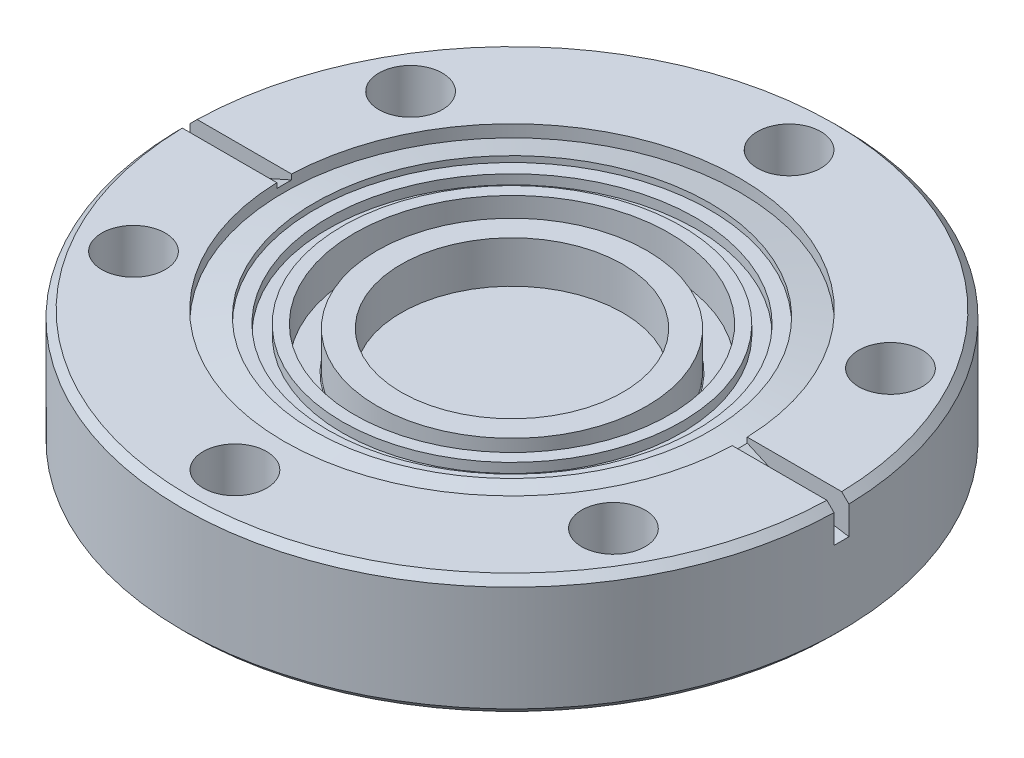
ISO-10303-21;
HEADER;
FILE_DESCRIPTION(('STEP AP214'),'2;1');
FILE_NAME('part.step','',(''),(''),'','','');
FILE_SCHEMA(('AUTOMOTIVE_DESIGN { 1 0 10303 214 1 1 1 1 }'));
ENDSEC;
DATA;
#1=APPLICATION_CONTEXT('core data for automotive mechanical design processes');
#2=APPLICATION_PROTOCOL_DEFINITION('international standard','automotive_design',2000,#1);
#3=PRODUCT_CONTEXT('',#1,'mechanical');
#4=PRODUCT('Part','Part','',(#3));
#5=PRODUCT_RELATED_PRODUCT_CATEGORY('part','',(#4));
#6=PRODUCT_DEFINITION_FORMATION('','',#4);
#7=PRODUCT_DEFINITION_CONTEXT('part definition',#1,'design');
#8=PRODUCT_DEFINITION('design','',#6,#7);
#9=PRODUCT_DEFINITION_SHAPE('','',#8);
#10=(LENGTH_UNIT() NAMED_UNIT(*) SI_UNIT(.MILLI.,.METRE.));
#11=(NAMED_UNIT(*) PLANE_ANGLE_UNIT() SI_UNIT($,.RADIAN.));
#12=(NAMED_UNIT(*) SI_UNIT($,.STERADIAN.) SOLID_ANGLE_UNIT());
#13=UNCERTAINTY_MEASURE_WITH_UNIT(LENGTH_MEASURE(1.E-05),#10,'distance_accuracy_value','');
#14=(GEOMETRIC_REPRESENTATION_CONTEXT(3) GLOBAL_UNCERTAINTY_ASSIGNED_CONTEXT((#13)) GLOBAL_UNIT_ASSIGNED_CONTEXT((#10,
#11,#12)) REPRESENTATION_CONTEXT('',''));
#15=CARTESIAN_POINT('',(0.,0.,0.));
#16=DIRECTION('',(0.,0.,1.));
#17=DIRECTION('',(1.,0.,0.));
#18=AXIS2_PLACEMENT_3D('',#15,#16,#17);
#19=CARTESIAN_POINT('',(0.,6.56400008,0.));
#20=DIRECTION('',(0.,1.,0.));
#21=DIRECTION('',(0.,0.,-1.));
#22=AXIS2_PLACEMENT_3D('',#19,#20,#21);
#23=PLANE('',#22);
#24=CARTESIAN_POINT('',(0.,6.56400008,0.));
#25=DIRECTION('',(0.,1.,0.));
#26=DIRECTION('',(0.,0.,-1.));
#27=AXIS2_PLACEMENT_3D('',#24,#25,#26);
#28=CIRCLE('',#27,11.7475);
#29=CARTESIAN_POINT('',(0.,6.56400008,-11.7475));
#30=VERTEX_POINT('',#29);
#31=EDGE_CURVE('E11',#30,#30,#28,.T.);
#32=ORIENTED_EDGE('',*,*,#31,.T.);
#33=EDGE_LOOP('',(#32));
#34=FACE_BOUND('',#33,.T.);
#35=ADVANCED_FACE('F16',(#34),#23,.T.);
#36=CARTESIAN_POINT('',(14.2820349882239,11.00900008,-0.395136489265077));
#37=DIRECTION('',(0.,1.,0.));
#38=DIRECTION('',(0.,0.,-1.));
#39=AXIS2_PLACEMENT_3D('',#36,#37,#38);
#40=PLANE('',#39);
#41=CARTESIAN_POINT('',(0.,11.00900008,0.));
#42=DIRECTION('',(0.,-1.,0.));
#43=DIRECTION('',(0.,0.,-1.));
#44=AXIS2_PLACEMENT_3D('',#41,#42,#43);
#45=CIRCLE('',#44,11.7475);
#46=CARTESIAN_POINT('',(0.,11.00900008,-11.7475));
#47=VERTEX_POINT('',#46);
#48=EDGE_CURVE('E27',#47,#47,#45,.T.);
#49=ORIENTED_EDGE('',*,*,#48,.T.);
#50=EDGE_LOOP('',(#49));
#51=FACE_BOUND('',#50,.T.);
#52=CARTESIAN_POINT('',(0.,11.00900008,0.));
#53=DIRECTION('',(0.,-1.,0.));
#54=DIRECTION('',(0.,0.,-1.));
#55=AXIS2_PLACEMENT_3D('',#52,#53,#54);
#56=CIRCLE('',#55,14.2875);
#57=CARTESIAN_POINT('',(0.,11.00900008,-14.2875));
#58=VERTEX_POINT('',#57);
#59=EDGE_CURVE('E331',#58,#58,#56,.T.);
#60=ORIENTED_EDGE('',*,*,#59,.F.);
#61=EDGE_LOOP('',(#60));
#62=FACE_BOUND('',#61,.T.);
#63=ADVANCED_FACE('F447',(#51,#62),#40,.T.);
#64=CARTESIAN_POINT('',(19.0427133176319,6.94500008,-0.526848652353438));
#65=DIRECTION('',(0.,1.,0.));
#66=DIRECTION('',(0.,0.,-1.));
#67=AXIS2_PLACEMENT_3D('',#64,#65,#66);
#68=PLANE('',#67);
#69=CARTESIAN_POINT('',(1.24288562814053E-05,6.94500008,-3.4386519109572E-07));
#70=DIRECTION('',(0.,-1.,0.));
#71=DIRECTION('',(-0.027656961005235,0.,-0.999617473090559));
#72=AXIS2_PLACEMENT_3D('',#69,#70,#71);
#73=CIRCLE('',#72,14.3891000000054);
#74=CARTESIAN_POINT('',(-0.397946348744294,6.94500008,-14.3835961259179));
#75=VERTEX_POINT('',#74);
#76=CARTESIAN_POINT('',(0.397946348744296,6.94500008,14.3835961259179));
#77=VERTEX_POINT('',#76);
#78=EDGE_CURVE('E354',#75,#77,#73,.T.);
#79=ORIENTED_EDGE('',*,*,#78,.T.);
#80=CARTESIAN_POINT('',(-1.2428855969155E-05,6.94500008,3.43865174182167E-07));
#81=DIRECTION('',(0.,-1.,0.));
#82=DIRECTION('',(0.0276569610052135,0.,0.99961747309056));
#83=AXIS2_PLACEMENT_3D('',#80,#81,#82);
#84=CIRCLE('',#83,14.3891000000054);
#85=EDGE_CURVE('E292',#77,#75,#84,.T.);
#86=ORIENTED_EDGE('',*,*,#85,.T.);
#87=EDGE_LOOP('',(#79,#86));
#88=FACE_BOUND('',#87,.T.);
#89=CARTESIAN_POINT('',(0.,6.94500008,0.));
#90=DIRECTION('',(0.,-1.,0.));
#91=DIRECTION('',(0.,0.,-1.));
#92=AXIS2_PLACEMENT_3D('',#89,#90,#91);
#93=CIRCLE('',#92,19.05);
#94=CARTESIAN_POINT('',(0.,6.94500008,-19.05));
#95=VERTEX_POINT('',#94);
#96=EDGE_CURVE('E280',#95,#95,#93,.T.);
#97=ORIENTED_EDGE('',*,*,#96,.F.);
#98=EDGE_LOOP('',(#97));
#99=FACE_BOUND('',#98,.T.);
#100=ADVANCED_FACE('F445',(#88,#99),#68,.T.);
#101=CARTESIAN_POINT('',(19.05,0.614634301939151,0.));
#102=DIRECTION('',(0.,1.,0.));
#103=DIRECTION('',(1.,0.,0.));
#104=AXIS2_PLACEMENT_3D('',#101,#102,#103);
#105=PLANE('',#104);
#106=CARTESIAN_POINT('',(0.,0.614634301939151,0.));
#107=DIRECTION('',(0.,1.,0.));
#108=DIRECTION('',(-1.,0.,0.));
#109=AXIS2_PLACEMENT_3D('',#106,#107,#108);
#110=CIRCLE('',#109,19.1135);
#111=CARTESIAN_POINT('',(-19.1135,0.614634301939151,0.));
#112=VERTEX_POINT('',#111);
#113=EDGE_CURVE('E288',#112,#112,#110,.T.);
#114=ORIENTED_EDGE('',*,*,#113,.T.);
#115=EDGE_LOOP('',(#114));
#116=FACE_BOUND('',#115,.T.);
#117=CARTESIAN_POINT('',(0.,0.614634301939151,0.));
#118=DIRECTION('',(0.,-1.,0.));
#119=DIRECTION('',(0.,0.,-1.));
#120=AXIS2_PLACEMENT_3D('',#117,#118,#119);
#121=CIRCLE('',#120,19.05);
#122=CARTESIAN_POINT('',(0.,0.614634301939151,-19.05));
#123=VERTEX_POINT('',#122);
#124=EDGE_CURVE('E293',#123,#123,#121,.T.);
#125=ORIENTED_EDGE('',*,*,#124,.T.);
#126=EDGE_LOOP('',(#125));
#127=FACE_BOUND('',#126,.T.);
#128=ADVANCED_FACE('F434',(#116,#127),#105,.T.);
#129=CARTESIAN_POINT('',(7.23381749884376,7.5184,-15.0384358639262));
#130=DIRECTION('',(0.,-1.,0.));
#131=DIRECTION('',(0.,0.,-1.));
#132=AXIS2_PLACEMENT_3D('',#129,#130,#131);
#133=PLANE('',#132);
#134=CARTESIAN_POINT('',(0.,7.5184,0.));
#135=DIRECTION('',(0.,1.,0.));
#136=DIRECTION('',(-1.,0.,0.));
#137=AXIS2_PLACEMENT_3D('',#134,#135,#136);
#138=CIRCLE('',#137,16.6878);
#139=CARTESIAN_POINT('',(-16.6878,7.5184,0.));
#140=VERTEX_POINT('',#139);
#141=EDGE_CURVE('E309',#140,#140,#138,.T.);
#142=ORIENTED_EDGE('',*,*,#141,.T.);
#143=EDGE_LOOP('',(#142));
#144=FACE_BOUND('',#143,.T.);
#145=CARTESIAN_POINT('',(0.,7.5184,0.));
#146=DIRECTION('',(0.,-1.,0.));
#147=DIRECTION('',(-1.,0.,0.));
#148=AXIS2_PLACEMENT_3D('',#145,#146,#147);
#149=CIRCLE('',#148,19.1135);
#150=CARTESIAN_POINT('',(-19.1135,7.5184,0.));
#151=VERTEX_POINT('',#150);
#152=EDGE_CURVE('E305',#151,#151,#149,.T.);
#153=ORIENTED_EDGE('',*,*,#152,.T.);
#154=EDGE_LOOP('',(#153));
#155=FACE_BOUND('',#154,.T.);
#156=ADVANCED_FACE('F455',(#144,#155),#133,.T.);
#157=CARTESIAN_POINT('',(7.23381749884379,11.4046,-15.0384358639262));
#158=DIRECTION('',(0.,1.,0.));
#159=DIRECTION('',(1.,0.,0.));
#160=AXIS2_PLACEMENT_3D('',#157,#158,#159);
#161=PLANE('',#160);
#162=CARTESIAN_POINT('',(0.,11.4046,0.));
#163=DIRECTION('',(0.,-1.,0.));
#164=DIRECTION('',(-1.,0.,0.));
#165=AXIS2_PLACEMENT_3D('',#162,#163,#164);
#166=CIRCLE('',#165,16.6878);
#167=CARTESIAN_POINT('',(-16.6878,11.4046,0.));
#168=VERTEX_POINT('',#167);
#169=EDGE_CURVE('E310',#168,#168,#166,.T.);
#170=ORIENTED_EDGE('',*,*,#169,.T.);
#171=EDGE_LOOP('',(#170));
#172=FACE_BOUND('',#171,.T.);
#173=CARTESIAN_POINT('',(0.,11.4046,0.));
#174=DIRECTION('',(0.,-1.,0.));
#175=DIRECTION('',(0.,0.,1.));
#176=AXIS2_PLACEMENT_3D('',#173,#174,#175);
#177=CIRCLE('',#176,17.9705);
#178=CARTESIAN_POINT('',(0.,11.4046,17.9705));
#179=VERTEX_POINT('',#178);
#180=EDGE_CURVE('E276',#179,#179,#177,.T.);
#181=ORIENTED_EDGE('',*,*,#180,.F.);
#182=EDGE_LOOP('',(#181));
#183=FACE_BOUND('',#182,.T.);
#184=ADVANCED_FACE('F474',(#172,#183),#161,.T.);
#185=CARTESIAN_POINT('',(-17.9705,10.3886,0.));
#186=DIRECTION('',(0.,1.,0.));
#187=DIRECTION('',(1.,0.,0.));
#188=AXIS2_PLACEMENT_3D('',#185,#186,#187);
#189=PLANE('',#188);
#190=CARTESIAN_POINT('',(0.,10.3886,0.));
#191=DIRECTION('',(0.,1.,0.));
#192=DIRECTION('',(0.,0.,1.));
#193=AXIS2_PLACEMENT_3D('',#190,#191,#192);
#194=CIRCLE('',#193,19.4945);
#195=CARTESIAN_POINT('',(0.,10.3886,19.4945));
#196=VERTEX_POINT('',#195);
#197=EDGE_CURVE('E360',#196,#196,#194,.T.);
#198=ORIENTED_EDGE('',*,*,#197,.T.);
#199=EDGE_LOOP('',(#198));
#200=FACE_BOUND('',#199,.T.);
#201=CARTESIAN_POINT('',(0.,10.3886,0.));
#202=DIRECTION('',(0.,-1.,0.));
#203=DIRECTION('',(0.,0.,1.));
#204=AXIS2_PLACEMENT_3D('',#201,#202,#203);
#205=CIRCLE('',#204,17.9705);
#206=CARTESIAN_POINT('',(0.,10.3886,17.9705));
#207=VERTEX_POINT('',#206);
#208=EDGE_CURVE('E407',#207,#207,#205,.T.);
#209=ORIENTED_EDGE('',*,*,#208,.T.);
#210=EDGE_LOOP('',(#209));
#211=FACE_BOUND('',#210,.T.);
#212=ADVANCED_FACE('F470',(#200,#211),#189,.T.);
#213=CARTESIAN_POINT('',(0.,4.064,0.));
#214=DIRECTION('',(0.,-1.,0.));
#215=DIRECTION('',(-1.,0.,0.));
#216=AXIS2_PLACEMENT_3D('',#213,#214,#215);
#217=PLANE('',#216);
#218=CARTESIAN_POINT('',(0.,4.064,0.));
#219=DIRECTION('',(0.,-1.,0.));
#220=DIRECTION('',(0.,0.,-1.));
#221=AXIS2_PLACEMENT_3D('',#218,#219,#220);
#222=CIRCLE('',#221,11.7475);
#223=CARTESIAN_POINT('',(0.,4.064,-11.7475));
#224=VERTEX_POINT('',#223);
#225=EDGE_CURVE('E395',#224,#224,#222,.T.);
#226=ORIENTED_EDGE('',*,*,#225,.T.);
#227=EDGE_LOOP('',(#226));
#228=FACE_BOUND('',#227,.T.);
#229=ADVANCED_FACE('F473',(#228),#217,.T.);
#230=CARTESIAN_POINT('',(-20.955,11.4046,0.));
#231=DIRECTION('',(0.,1.,0.));
#232=DIRECTION('',(1.,0.,0.));
#233=AXIS2_PLACEMENT_3D('',#230,#231,#232);
#234=PLANE('',#233);
#235=CARTESIAN_POINT('',(0.,11.4046,0.));
#236=DIRECTION('',(0.,1.,0.));
#237=DIRECTION('',(0.,0.,1.));
#238=AXIS2_PLACEMENT_3D('',#235,#236,#237);
#239=CIRCLE('',#238,20.955);
#240=CARTESIAN_POINT('',(0.,11.4046,20.955));
#241=VERTEX_POINT('',#240);
#242=EDGE_CURVE('E391',#241,#241,#239,.T.);
#243=ORIENTED_EDGE('',*,*,#242,.T.);
#244=EDGE_LOOP('',(#243));
#245=FACE_BOUND('',#244,.T.);
#246=CARTESIAN_POINT('',(0.,11.4046,0.));
#247=DIRECTION('',(0.,-1.,0.));
#248=DIRECTION('',(0.,0.,1.));
#249=AXIS2_PLACEMENT_3D('',#246,#247,#248);
#250=CIRCLE('',#249,19.4945);
#251=CARTESIAN_POINT('',(0.,11.4046,19.4945));
#252=VERTEX_POINT('',#251);
#253=EDGE_CURVE('E396',#252,#252,#250,.T.);
#254=ORIENTED_EDGE('',*,*,#253,.T.);
#255=EDGE_LOOP('',(#254));
#256=FACE_BOUND('',#255,.T.);
#257=ADVANCED_FACE('F613',(#245,#256),#234,.T.);
#258=CARTESIAN_POINT('',(11.7475,0.0254000000000026,0.));
#259=DIRECTION('',(0.,-1.,0.));
#260=DIRECTION('',(0.,0.,-1.));
#261=AXIS2_PLACEMENT_3D('',#258,#259,#260);
#262=PLANE('',#261);
#263=CARTESIAN_POINT('',(0.,0.0254000000000018,0.));
#264=DIRECTION('',(0.,1.,0.));
#265=DIRECTION('',(0.,0.,-1.));
#266=AXIS2_PLACEMENT_3D('',#263,#264,#265);
#267=CIRCLE('',#266,11.7475);
#268=CARTESIAN_POINT('',(0.,0.0254000000000018,-11.7475));
#269=VERTEX_POINT('',#268);
#270=EDGE_CURVE('E558',#269,#269,#267,.T.);
#271=ORIENTED_EDGE('',*,*,#270,.T.);
#272=EDGE_LOOP('',(#271));
#273=FACE_BOUND('',#272,.T.);
#274=CARTESIAN_POINT('',(0.,0.0254000000000018,0.));
#275=DIRECTION('',(0.,1.,0.));
#276=DIRECTION('',(-1.,0.,0.));
#277=AXIS2_PLACEMENT_3D('',#274,#275,#276);
#278=CIRCLE('',#277,19.6215);
#279=CARTESIAN_POINT('',(-19.6215,0.025400000000001,0.));
#280=VERTEX_POINT('',#279);
#281=EDGE_CURVE('E281',#280,#280,#278,.T.);
#282=ORIENTED_EDGE('',*,*,#281,.F.);
#283=EDGE_LOOP('',(#282));
#284=FACE_BOUND('',#283,.T.);
#285=ADVANCED_FACE('F616',(#273,#284),#262,.T.);
#286=CARTESIAN_POINT('',(7.54210804673972,8.2296,-15.6793433284467));
#287=DIRECTION('',(0.,1.,0.));
#288=DIRECTION('',(1.,0.,0.));
#289=AXIS2_PLACEMENT_3D('',#286,#287,#288);
#290=PLANE('',#289);
#291=CARTESIAN_POINT('',(0.,8.2296,0.));
#292=DIRECTION('',(0.,1.,0.));
#293=DIRECTION('',(-1.,0.,0.));
#294=AXIS2_PLACEMENT_3D('',#291,#292,#293);
#295=CIRCLE('',#294,19.6215);
#296=CARTESIAN_POINT('',(-19.6215,8.2296,0.));
#297=VERTEX_POINT('',#296);
#298=EDGE_CURVE('E401',#297,#297,#295,.T.);
#299=ORIENTED_EDGE('',*,*,#298,.T.);
#300=EDGE_LOOP('',(#299));
#301=FACE_BOUND('',#300,.T.);
#302=CARTESIAN_POINT('',(0.,8.2296,0.));
#303=DIRECTION('',(0.,1.,0.));
#304=DIRECTION('',(-1.,0.,0.));
#305=AXIS2_PLACEMENT_3D('',#302,#303,#304);
#306=CIRCLE('',#305,17.399);
#307=CARTESIAN_POINT('',(-17.399,8.2296,0.));
#308=VERTEX_POINT('',#307);
#309=EDGE_CURVE('E20',#308,#308,#306,.T.);
#310=ORIENTED_EDGE('',*,*,#309,.F.);
#311=EDGE_LOOP('',(#310));
#312=FACE_BOUND('',#311,.T.);
#313=ADVANCED_FACE('F722',(#301,#312),#290,.T.);
#314=CARTESIAN_POINT('',(39.3735976154095,43.5831901653029,-0.7874));
#315=DIRECTION('',(0.,0.,1.));
#316=DIRECTION('',(1.,0.,0.));
#317=AXIS2_PLACEMENT_3D('',#314,#315,#316);
#318=CYLINDRICAL_SURFACE('',#317,34.925);
#319=CARTESIAN_POINT('',(39.3735976154095,43.5831901653029,0.7874));
#320=DIRECTION('',(0.,0.,1.));
#321=DIRECTION('',(1.,0.,0.));
#322=AXIS2_PLACEMENT_3D('',#319,#320,#321);
#323=CIRCLE('',#322,34.925);
#324=CARTESIAN_POINT('',(24.1425630453769,12.15436246005,0.7874));
#325=VERTEX_POINT('',#324);
#326=CARTESIAN_POINT('',(34.9161227263281,8.94381166895559,0.7874));
#327=VERTEX_POINT('',#326);
#328=EDGE_CURVE('E397',#325,#327,#323,.T.);
#329=ORIENTED_EDGE('',*,*,#328,.T.);
#330=CARTESIAN_POINT('',(0.573146945675652,13.363144774907,0.));
#331=DIRECTION('',(-0.127629918083853,-0.991821861026419,0.));
#332=DIRECTION('',(0.991565520297985,-0.127596931569382,-0.022734159546025));
#333=AXIS2_PLACEMENT_3D('',#330,#331,#332);
#334=CIRCLE('',#333,34.6351048696525);
#335=CARTESIAN_POINT('',(34.9161227263281,8.94381166895559,-0.7874));
#336=VERTEX_POINT('',#335);
#337=EDGE_CURVE('E314',#336,#327,#334,.T.);
#338=ORIENTED_EDGE('',*,*,#337,.F.);
#339=CARTESIAN_POINT('',(39.3735976154095,43.5831901653029,-0.7874));
#340=DIRECTION('',(0.,0.,1.));
#341=DIRECTION('',(1.,0.,0.));
#342=AXIS2_PLACEMENT_3D('',#339,#340,#341);
#343=CIRCLE('',#342,34.925);
#344=CARTESIAN_POINT('',(24.1425630453769,12.15436246005,-0.7874));
#345=VERTEX_POINT('',#344);
#346=EDGE_CURVE('E287',#345,#336,#343,.T.);
#347=ORIENTED_EDGE('',*,*,#346,.F.);
#348=CARTESIAN_POINT('',(4.59799701094588,21.6260476186121,2.09738910267321E-13));
#349=DIRECTION('',(-0.436106931139257,-0.899894851975662,0.));
#350=DIRECTION('',(0.899304030600688,-0.435820607358067,-0.0362306327215305));
#351=AXIS2_PLACEMENT_3D('',#348,#349,#350);
#352=CIRCLE('',#351,21.732990589819);
#353=EDGE_CURVE('E353',#345,#325,#352,.T.);
#354=ORIENTED_EDGE('',*,*,#353,.T.);
#355=EDGE_LOOP('',(#329,#338,#347,#354));
#356=FACE_BOUND('',#355,.T.);
#357=ADVANCED_FACE('F719',(#356),#318,.F.);
#358=CARTESIAN_POINT('',(-39.3735976154095,43.5831901653029,-0.7874));
#359=DIRECTION('',(0.,0.,1.));
#360=DIRECTION('',(1.,0.,0.));
#361=AXIS2_PLACEMENT_3D('',#358,#359,#360);
#362=CYLINDRICAL_SURFACE('',#361,34.925);
#363=CARTESIAN_POINT('',(-39.3735976154095,43.5831901653029,-0.7874));
#364=DIRECTION('',(0.,0.,-1.));
#365=DIRECTION('',(1.,0.,0.));
#366=AXIS2_PLACEMENT_3D('',#363,#364,#365);
#367=CIRCLE('',#366,34.925);
#368=CARTESIAN_POINT('',(-24.1425630453769,12.15436246005,-0.7874));
#369=VERTEX_POINT('',#368);
#370=CARTESIAN_POINT('',(-34.9161227263281,8.94381166895559,-0.7874));
#371=VERTEX_POINT('',#370);
#372=EDGE_CURVE('E349',#369,#371,#367,.T.);
#373=ORIENTED_EDGE('',*,*,#372,.T.);
#374=CARTESIAN_POINT('',(-0.573146945692759,13.3631447748945,0.));
#375=DIRECTION('',(0.127629918083561,-0.991821861026456,0.));
#376=DIRECTION('',(-0.991565520298023,-0.12759693156909,0.0227341595460376));
#377=AXIS2_PLACEMENT_3D('',#374,#375,#376);
#378=CIRCLE('',#377,34.6351048696339);
#379=CARTESIAN_POINT('',(-34.9161227263281,8.94381166895559,0.7874));
#380=VERTEX_POINT('',#379);
#381=EDGE_CURVE('E324',#380,#371,#378,.T.);
#382=ORIENTED_EDGE('',*,*,#381,.F.);
#383=CARTESIAN_POINT('',(-39.3735976154095,43.5831901653029,0.7874));
#384=DIRECTION('',(0.,0.,-1.));
#385=DIRECTION('',(1.,0.,0.));
#386=AXIS2_PLACEMENT_3D('',#383,#384,#385);
#387=CIRCLE('',#386,34.925);
#388=CARTESIAN_POINT('',(-24.1425630453769,12.15436246005,0.7874));
#389=VERTEX_POINT('',#388);
#390=EDGE_CURVE('E386',#389,#380,#387,.T.);
#391=ORIENTED_EDGE('',*,*,#390,.F.);
#392=CARTESIAN_POINT('',(-4.59799701093826,21.6260476186169,0.));
#393=DIRECTION('',(0.436106931139297,-0.899894851975643,0.));
#394=DIRECTION('',(-0.89930403060067,-0.435820607358107,0.0362306327215076));
#395=AXIS2_PLACEMENT_3D('',#392,#393,#394);
#396=CIRCLE('',#395,21.7329905898279);
#397=EDGE_CURVE('E286',#389,#369,#396,.T.);
#398=ORIENTED_EDGE('',*,*,#397,.T.);
#399=EDGE_LOOP('',(#373,#382,#391,#398));
#400=FACE_BOUND('',#399,.T.);
#401=ADVANCED_FACE('F721',(#400),#362,.F.);
#402=CARTESIAN_POINT('',(39.3735976154095,43.5831901653029,-0.7874));
#403=DIRECTION('',(0.,0.,1.));
#404=DIRECTION('',(1.,0.,0.));
#405=AXIS2_PLACEMENT_3D('',#402,#403,#404);
#406=PLANE('',#405);
#407=DIRECTION('',(1.,0.,0.));
#408=VECTOR('',#407,1.);
#409=CARTESIAN_POINT('',(-34.163,12.7,-0.7874));
#410=LINE('',#409,#408);
#411=CARTESIAN_POINT('',(24.1425630453769,12.7,-0.7874));
#412=VERTEX_POINT('',#411);
#413=CARTESIAN_POINT('',(34.1539246681843,12.7,-0.7874));
#414=VERTEX_POINT('',#413);
#415=EDGE_CURVE('E275',#412,#414,#410,.T.);
#416=ORIENTED_EDGE('',*,*,#415,.F.);
#417=DIRECTION('',(0.,-1.,0.));
#418=VECTOR('',#417,1.);
#419=CARTESIAN_POINT('',(24.1425630453769,43.5831901653029,-0.7874));
#420=LINE('',#419,#418);
#421=EDGE_CURVE('E282',#412,#345,#420,.T.);
#422=ORIENTED_EDGE('',*,*,#421,.T.);
#423=ORIENTED_EDGE('',*,*,#346,.T.);
#424=DIRECTION('',(0.,-1.,0.));
#425=VECTOR('',#424,1.);
#426=CARTESIAN_POINT('',(34.9161227263281,0.,-0.7874));
#427=LINE('',#426,#425);
#428=CARTESIAN_POINT('',(34.9161227263281,11.938,-0.7874));
#429=VERTEX_POINT('',#428);
#430=EDGE_CURVE('E327',#429,#336,#427,.T.);
#431=ORIENTED_EDGE('',*,*,#430,.F.);
#432=DIRECTION('',(-0.707198658456387,0.707014891977168,0.));
#433=VECTOR('',#432,1.);
#434=CARTESIAN_POINT('',(34.9161227263281,11.938,-0.7874));
#435=LINE('',#434,#433);
#436=EDGE_CURVE('E381',#429,#414,#435,.T.);
#437=ORIENTED_EDGE('',*,*,#436,.T.);
#438=EDGE_LOOP('',(#416,#422,#423,#431,#437));
#439=FACE_BOUND('',#438,.T.);
#440=ADVANCED_FACE('F468',(#439),#406,.T.);
#441=CARTESIAN_POINT('',(39.3735976154095,43.5831901653029,0.7874));
#442=DIRECTION('',(0.,0.,1.));
#443=DIRECTION('',(1.,0.,0.));
#444=AXIS2_PLACEMENT_3D('',#441,#442,#443);
#445=PLANE('',#444);
#446=DIRECTION('',(-1.,0.,0.));
#447=VECTOR('',#446,1.);
#448=CARTESIAN_POINT('',(-34.163,12.7,0.7874));
#449=LINE('',#448,#447);
#450=CARTESIAN_POINT('',(34.1539246681843,12.7,0.7874));
#451=VERTEX_POINT('',#450);
#452=CARTESIAN_POINT('',(24.1425630453769,12.7,0.7874));
#453=VERTEX_POINT('',#452);
#454=EDGE_CURVE('E337',#451,#453,#449,.T.);
#455=ORIENTED_EDGE('',*,*,#454,.F.);
#456=DIRECTION('',(-0.70719865845639,0.707014891977165,0.));
#457=VECTOR('',#456,1.);
#458=CARTESIAN_POINT('',(34.5350236972561,12.319,0.7874));
#459=LINE('',#458,#457);
#460=CARTESIAN_POINT('',(34.9161227263281,11.938,0.7874));
#461=VERTEX_POINT('',#460);
#462=EDGE_CURVE('E415',#461,#451,#459,.T.);
#463=ORIENTED_EDGE('',*,*,#462,.F.);
#464=DIRECTION('',(0.,1.,0.));
#465=VECTOR('',#464,1.);
#466=CARTESIAN_POINT('',(34.9161227263281,0.,0.7874));
#467=LINE('',#466,#465);
#468=EDGE_CURVE('E311',#327,#461,#467,.T.);
#469=ORIENTED_EDGE('',*,*,#468,.F.);
#470=ORIENTED_EDGE('',*,*,#328,.F.);
#471=DIRECTION('',(0.,-1.,0.));
#472=VECTOR('',#471,1.);
#473=CARTESIAN_POINT('',(24.1425630453769,43.5831901653029,0.7874));
#474=LINE('',#473,#472);
#475=EDGE_CURVE('E316',#453,#325,#474,.T.);
#476=ORIENTED_EDGE('',*,*,#475,.F.);
#477=EDGE_LOOP('',(#455,#463,#469,#470,#476));
#478=FACE_BOUND('',#477,.T.);
#479=ADVANCED_FACE('F650',(#478),#445,.F.);
#480=CARTESIAN_POINT('',(0.,11.938,0.));
#481=DIRECTION('',(0.,-1.,0.));
#482=DIRECTION('',(0.,0.,-1.));
#483=AXIS2_PLACEMENT_3D('',#480,#481,#482);
#484=CONICAL_SURFACE('',#483,34.925,0.78539816339745);
#485=CARTESIAN_POINT('',(0.,11.938,0.));
#486=DIRECTION('',(0.,-1.,0.));
#487=DIRECTION('',(0.,0.,1.));
#488=AXIS2_PLACEMENT_3D('',#485,#486,#487);
#489=CIRCLE('',#488,34.925);
#490=CARTESIAN_POINT('',(-34.9161227263281,11.938,0.7874));
#491=VERTEX_POINT('',#490);
#492=EDGE_CURVE('E315',#461,#491,#489,.T.);
#493=ORIENTED_EDGE('',*,*,#492,.F.);
#494=ORIENTED_EDGE('',*,*,#462,.T.);
#495=CARTESIAN_POINT('',(0.,12.7,0.));
#496=DIRECTION('',(0.,1.,0.));
#497=DIRECTION('',(0.,0.,-1.));
#498=AXIS2_PLACEMENT_3D('',#495,#496,#497);
#499=CIRCLE('',#498,34.163);
#500=CARTESIAN_POINT('',(-34.1539246681843,12.7,0.7874));
#501=VERTEX_POINT('',#500);
#502=EDGE_CURVE('E341',#501,#451,#499,.T.);
#503=ORIENTED_EDGE('',*,*,#502,.F.);
#504=DIRECTION('',(0.707198658456389,0.707014891977166,0.));
#505=VECTOR('',#504,1.);
#506=CARTESIAN_POINT('',(-34.9161227263281,11.938,0.7874));
#507=LINE('',#506,#505);
#508=EDGE_CURVE('E382',#491,#501,#507,.T.);
#509=ORIENTED_EDGE('',*,*,#508,.F.);
#510=EDGE_LOOP('',(#493,#494,#503,#509));
#511=FACE_BOUND('',#510,.T.);
#512=ADVANCED_FACE('F646',(#511),#484,.T.);
#513=CARTESIAN_POINT('',(-39.3735976154095,43.5831901653029,0.7874));
#514=DIRECTION('',(0.,0.,-1.));
#515=DIRECTION('',(0.,-1.,0.));
#516=AXIS2_PLACEMENT_3D('',#513,#514,#515);
#517=PLANE('',#516);
#518=DIRECTION('',(-1.,0.,0.));
#519=VECTOR('',#518,1.);
#520=CARTESIAN_POINT('',(-34.163,12.7,0.7874));
#521=LINE('',#520,#519);
#522=CARTESIAN_POINT('',(-24.1425630453769,12.7,0.7874));
#523=VERTEX_POINT('',#522);
#524=EDGE_CURVE('E387',#523,#501,#521,.T.);
#525=ORIENTED_EDGE('',*,*,#524,.F.);
#526=DIRECTION('',(0.,-1.,0.));
#527=VECTOR('',#526,1.);
#528=CARTESIAN_POINT('',(-24.1425630453769,43.5831901653029,0.7874));
#529=LINE('',#528,#527);
#530=EDGE_CURVE('E695',#523,#389,#529,.T.);
#531=ORIENTED_EDGE('',*,*,#530,.T.);
#532=ORIENTED_EDGE('',*,*,#390,.T.);
#533=DIRECTION('',(0.,-1.,0.));
#534=VECTOR('',#533,1.);
#535=CARTESIAN_POINT('',(-34.9161227263281,0.,0.78740000000001));
#536=LINE('',#535,#534);
#537=EDGE_CURVE('E542',#491,#380,#536,.T.);
#538=ORIENTED_EDGE('',*,*,#537,.F.);
#539=ORIENTED_EDGE('',*,*,#508,.T.);
#540=EDGE_LOOP('',(#525,#531,#532,#538,#539));
#541=FACE_BOUND('',#540,.T.);
#542=ADVANCED_FACE('F649',(#541),#517,.T.);
#543=CARTESIAN_POINT('',(-39.3735976154095,43.5831901653029,-0.7874));
#544=DIRECTION('',(0.,0.,-1.));
#545=DIRECTION('',(0.,-1.,0.));
#546=AXIS2_PLACEMENT_3D('',#543,#544,#545);
#547=PLANE('',#546);
#548=DIRECTION('',(1.,0.,0.));
#549=VECTOR('',#548,1.);
#550=CARTESIAN_POINT('',(-34.163,12.7,-0.7874));
#551=LINE('',#550,#549);
#552=CARTESIAN_POINT('',(-34.1539246681843,12.7,-0.7874));
#553=VERTEX_POINT('',#552);
#554=CARTESIAN_POINT('',(-24.1425630453769,12.7,-0.7874));
#555=VERTEX_POINT('',#554);
#556=EDGE_CURVE('E274',#553,#555,#551,.T.);
#557=ORIENTED_EDGE('',*,*,#556,.F.);
#558=DIRECTION('',(0.707198658456392,0.707014891977163,0.));
#559=VECTOR('',#558,1.);
#560=CARTESIAN_POINT('',(-34.5350236972561,12.319,-0.7874));
#561=LINE('',#560,#559);
#562=CARTESIAN_POINT('',(-34.9161227263281,11.938,-0.78740000000001));
#563=VERTEX_POINT('',#562);
#564=EDGE_CURVE('E427',#563,#553,#561,.T.);
#565=ORIENTED_EDGE('',*,*,#564,.F.);
#566=DIRECTION('',(0.,1.,0.));
#567=VECTOR('',#566,1.);
#568=CARTESIAN_POINT('',(-34.9161227263281,0.,-0.787400000000023));
#569=LINE('',#568,#567);
#570=EDGE_CURVE('E423',#371,#563,#569,.T.);
#571=ORIENTED_EDGE('',*,*,#570,.F.);
#572=ORIENTED_EDGE('',*,*,#372,.F.);
#573=DIRECTION('',(0.,-1.,0.));
#574=VECTOR('',#573,1.);
#575=CARTESIAN_POINT('',(-24.1425630453769,43.5831901653029,-0.7874));
#576=LINE('',#575,#574);
#577=EDGE_CURVE('E304',#555,#369,#576,.T.);
#578=ORIENTED_EDGE('',*,*,#577,.F.);
#579=EDGE_LOOP('',(#557,#565,#571,#572,#578));
#580=FACE_BOUND('',#579,.T.);
#581=ADVANCED_FACE('F480',(#580),#547,.F.);
#582=CARTESIAN_POINT('',(-34.163,12.7,0.));
#583=DIRECTION('',(0.,1.,0.));
#584=DIRECTION('',(1.,0.,0.));
#585=AXIS2_PLACEMENT_3D('',#582,#583,#584);
#586=PLANE('',#585);
#587=ORIENTED_EDGE('',*,*,#524,.T.);
#588=ORIENTED_EDGE('',*,*,#502,.T.);
#589=ORIENTED_EDGE('',*,*,#454,.T.);
#590=CARTESIAN_POINT('',(0.,12.7,0.));
#591=DIRECTION('',(0.,-1.,0.));
#592=DIRECTION('',(0.,0.,1.));
#593=AXIS2_PLACEMENT_3D('',#590,#591,#592);
#594=CIRCLE('',#593,24.1554);
#595=EDGE_CURVE('E342',#453,#523,#594,.T.);
#596=ORIENTED_EDGE('',*,*,#595,.T.);
#597=EDGE_LOOP('',(#587,#588,#589,#596));
#598=FACE_BOUND('',#597,.T.);
#599=CARTESIAN_POINT('',(-25.4285843160804,12.7,14.6811999999998));
#600=DIRECTION('',(0.,-1.,0.));
#601=DIRECTION('',(0.,0.,1.));
#602=AXIS2_PLACEMENT_3D('',#599,#600,#601);
#603=CIRCLE('',#602,3.3655);
#604=CARTESIAN_POINT('',(-25.4285843160804,12.7,18.0466999999998));
#605=VERTEX_POINT('',#604);
#606=EDGE_CURVE('E256',#605,#605,#603,.T.);
#607=ORIENTED_EDGE('',*,*,#606,.T.);
#608=EDGE_LOOP('',(#607));
#609=FACE_BOUND('',#608,.T.);
#610=CARTESIAN_POINT('',(-2.05036543327295E-13,12.7,29.3624));
#611=DIRECTION('',(0.,-1.,0.));
#612=DIRECTION('',(0.,0.,1.));
#613=AXIS2_PLACEMENT_3D('',#610,#611,#612);
#614=CIRCLE('',#613,3.3655);
#615=CARTESIAN_POINT('',(-2.05036543327295E-13,12.7,32.7279));
#616=VERTEX_POINT('',#615);
#617=EDGE_CURVE('E248',#616,#616,#614,.T.);
#618=ORIENTED_EDGE('',*,*,#617,.T.);
#619=EDGE_LOOP('',(#618));
#620=FACE_BOUND('',#619,.T.);
#621=CARTESIAN_POINT('',(25.4285843160802,12.7,14.6812000000001));
#622=DIRECTION('',(0.,-1.,0.));
#623=DIRECTION('',(0.,0.,1.));
#624=AXIS2_PLACEMENT_3D('',#621,#622,#623);
#625=CIRCLE('',#624,3.3655);
#626=CARTESIAN_POINT('',(25.4285843160802,12.7,18.0467));
#627=VERTEX_POINT('',#626);
#628=EDGE_CURVE('E243',#627,#627,#625,.T.);
#629=ORIENTED_EDGE('',*,*,#628,.T.);
#630=EDGE_LOOP('',(#629));
#631=FACE_BOUND('',#630,.T.);
#632=ADVANCED_FACE('F476',(#598,#609,#620,#631),#586,.T.);
#633=CARTESIAN_POINT('',(-34.163,12.7,0.));
#634=DIRECTION('',(0.,1.,0.));
#635=DIRECTION('',(1.,0.,0.));
#636=AXIS2_PLACEMENT_3D('',#633,#634,#635);
#637=PLANE('',#636);
#638=CARTESIAN_POINT('',(-25.4285843160799,12.7,-14.6812000000003));
#639=DIRECTION('',(0.,-1.,0.));
#640=DIRECTION('',(0.,0.,1.));
#641=AXIS2_PLACEMENT_3D('',#638,#639,#640);
#642=CIRCLE('',#641,3.3655);
#643=CARTESIAN_POINT('',(-25.4285843160799,12.7,-11.3157000000003));
#644=VERTEX_POINT('',#643);
#645=EDGE_CURVE('E249',#644,#644,#642,.T.);
#646=ORIENTED_EDGE('',*,*,#645,.T.);
#647=EDGE_LOOP('',(#646));
#648=FACE_BOUND('',#647,.T.);
#649=CARTESIAN_POINT('',(25.4285843160802,12.7,-14.6812));
#650=DIRECTION('',(0.,-1.,0.));
#651=DIRECTION('',(0.,0.,1.));
#652=AXIS2_PLACEMENT_3D('',#649,#650,#651);
#653=CIRCLE('',#652,3.3655);
#654=CARTESIAN_POINT('',(25.4285843160802,12.7,-11.3157));
#655=VERTEX_POINT('',#654);
#656=EDGE_CURVE('E260',#655,#655,#653,.T.);
#657=ORIENTED_EDGE('',*,*,#656,.T.);
#658=EDGE_LOOP('',(#657));
#659=FACE_BOUND('',#658,.T.);
#660=CARTESIAN_POINT('',(0.,12.7,-29.3624));
#661=DIRECTION('',(0.,-1.,0.));
#662=DIRECTION('',(0.,0.,1.));
#663=AXIS2_PLACEMENT_3D('',#660,#661,#662);
#664=CIRCLE('',#663,3.3655);
#665=CARTESIAN_POINT('',(0.,12.7,-25.9969));
#666=VERTEX_POINT('',#665);
#667=EDGE_CURVE('E365',#666,#666,#664,.T.);
#668=ORIENTED_EDGE('',*,*,#667,.T.);
#669=EDGE_LOOP('',(#668));
#670=FACE_BOUND('',#669,.T.);
#671=ORIENTED_EDGE('',*,*,#556,.T.);
#672=CARTESIAN_POINT('',(0.,12.7,0.));
#673=DIRECTION('',(0.,-1.,0.));
#674=DIRECTION('',(0.,0.,1.));
#675=AXIS2_PLACEMENT_3D('',#672,#673,#674);
#676=CIRCLE('',#675,24.1554);
#677=EDGE_CURVE('E270',#555,#412,#676,.T.);
#678=ORIENTED_EDGE('',*,*,#677,.T.);
#679=ORIENTED_EDGE('',*,*,#415,.T.);
#680=CARTESIAN_POINT('',(0.,12.7,0.));
#681=DIRECTION('',(0.,1.,0.));
#682=DIRECTION('',(0.,0.,-1.));
#683=AXIS2_PLACEMENT_3D('',#680,#681,#682);
#684=CIRCLE('',#683,34.163);
#685=EDGE_CURVE('E294',#414,#553,#684,.T.);
#686=ORIENTED_EDGE('',*,*,#685,.T.);
#687=EDGE_LOOP('',(#671,#678,#679,#686));
#688=FACE_BOUND('',#687,.T.);
#689=ADVANCED_FACE('F479',(#648,#659,#670,#688),#637,.T.);
#690=CARTESIAN_POINT('',(-17.3355,8.8646,0.));
#691=DIRECTION('',(0.,-1.,0.));
#692=DIRECTION('',(0.,0.,-1.));
#693=AXIS2_PLACEMENT_3D('',#690,#691,#692);
#694=PLANE('',#693);
#695=CARTESIAN_POINT('',(0.,8.8646,0.));
#696=DIRECTION('',(0.,1.,0.));
#697=DIRECTION('',(-1.,0.,0.));
#698=AXIS2_PLACEMENT_3D('',#695,#696,#697);
#699=CIRCLE('',#698,17.399);
#700=CARTESIAN_POINT('',(-17.399,8.8646,0.));
#701=VERTEX_POINT('',#700);
#702=EDGE_CURVE('E298',#701,#701,#699,.T.);
#703=ORIENTED_EDGE('',*,*,#702,.T.);
#704=EDGE_LOOP('',(#703));
#705=FACE_BOUND('',#704,.T.);
#706=CARTESIAN_POINT('',(0.,8.8646,0.));
#707=DIRECTION('',(0.,-1.,0.));
#708=DIRECTION('',(0.,0.,1.));
#709=AXIS2_PLACEMENT_3D('',#706,#707,#708);
#710=CIRCLE('',#709,19.8755);
#711=CARTESIAN_POINT('',(0.,8.8646,19.8755));
#712=VERTEX_POINT('',#711);
#713=EDGE_CURVE('E374',#712,#712,#710,.T.);
#714=ORIENTED_EDGE('',*,*,#713,.T.);
#715=EDGE_LOOP('',(#714));
#716=FACE_BOUND('',#715,.T.);
#717=ADVANCED_FACE('F496',(#705,#716),#694,.T.);
#718=CARTESIAN_POINT('',(-34.163,0.,0.));
#719=DIRECTION('',(0.,-1.,0.));
#720=DIRECTION('',(0.,0.,-1.));
#721=AXIS2_PLACEMENT_3D('',#718,#719,#720);
#722=PLANE('',#721);
#723=CARTESIAN_POINT('',(-25.4285843160799,0.,-14.6812000000003));
#724=DIRECTION('',(0.,1.,0.));
#725=DIRECTION('',(0.,0.,1.));
#726=AXIS2_PLACEMENT_3D('',#723,#724,#725);
#727=CIRCLE('',#726,3.3655);
#728=CARTESIAN_POINT('',(-25.4285843160799,0.,-11.3157000000003));
#729=VERTEX_POINT('',#728);
#730=EDGE_CURVE('E364',#729,#729,#727,.T.);
#731=ORIENTED_EDGE('',*,*,#730,.T.);
#732=EDGE_LOOP('',(#731));
#733=FACE_BOUND('',#732,.T.);
#734=CARTESIAN_POINT('',(-25.4285843160804,0.,14.6811999999998));
#735=DIRECTION('',(0.,1.,0.));
#736=DIRECTION('',(0.,0.,1.));
#737=AXIS2_PLACEMENT_3D('',#734,#735,#736);
#738=CIRCLE('',#737,3.3655);
#739=CARTESIAN_POINT('',(-25.4285843160804,0.,18.0466999999998));
#740=VERTEX_POINT('',#739);
#741=EDGE_CURVE('E336',#740,#740,#738,.T.);
#742=ORIENTED_EDGE('',*,*,#741,.T.);
#743=EDGE_LOOP('',(#742));
#744=FACE_BOUND('',#743,.T.);
#745=CARTESIAN_POINT('',(-2.05036543327295E-13,0.,29.3624));
#746=DIRECTION('',(0.,1.,0.));
#747=DIRECTION('',(0.,0.,1.));
#748=AXIS2_PLACEMENT_3D('',#745,#746,#747);
#749=CIRCLE('',#748,3.3655);
#750=CARTESIAN_POINT('',(-2.05036543327295E-13,0.,32.7279));
#751=VERTEX_POINT('',#750);
#752=EDGE_CURVE('E332',#751,#751,#749,.T.);
#753=ORIENTED_EDGE('',*,*,#752,.T.);
#754=EDGE_LOOP('',(#753));
#755=FACE_BOUND('',#754,.T.);
#756=CARTESIAN_POINT('',(25.4285843160802,0.,14.6812000000001));
#757=DIRECTION('',(0.,1.,0.));
#758=DIRECTION('',(0.,0.,1.));
#759=AXIS2_PLACEMENT_3D('',#756,#757,#758);
#760=CIRCLE('',#759,3.3655);
#761=CARTESIAN_POINT('',(25.4285843160802,0.,18.0467));
#762=VERTEX_POINT('',#761);
#763=EDGE_CURVE('E269',#762,#762,#760,.T.);
#764=ORIENTED_EDGE('',*,*,#763,.T.);
#765=EDGE_LOOP('',(#764));
#766=FACE_BOUND('',#765,.T.);
#767=CARTESIAN_POINT('',(25.4285843160802,0.,-14.6812));
#768=DIRECTION('',(0.,1.,0.));
#769=DIRECTION('',(0.,0.,1.));
#770=AXIS2_PLACEMENT_3D('',#767,#768,#769);
#771=CIRCLE('',#770,3.3655);
#772=CARTESIAN_POINT('',(25.4285843160802,0.,-11.3157));
#773=VERTEX_POINT('',#772);
#774=EDGE_CURVE('E266',#773,#773,#771,.T.);
#775=ORIENTED_EDGE('',*,*,#774,.T.);
#776=EDGE_LOOP('',(#775));
#777=FACE_BOUND('',#776,.T.);
#778=CARTESIAN_POINT('',(0.,0.,-29.3624));
#779=DIRECTION('',(0.,1.,0.));
#780=DIRECTION('',(0.,0.,1.));
#781=AXIS2_PLACEMENT_3D('',#778,#779,#780);
#782=CIRCLE('',#781,3.3655);
#783=CARTESIAN_POINT('',(0.,0.,-25.9969));
#784=VERTEX_POINT('',#783);
#785=EDGE_CURVE('E264',#784,#784,#782,.T.);
#786=ORIENTED_EDGE('',*,*,#785,.T.);
#787=EDGE_LOOP('',(#786));
#788=FACE_BOUND('',#787,.T.);
#789=CARTESIAN_POINT('',(0.,0.,0.));
#790=DIRECTION('',(0.,1.,0.));
#791=DIRECTION('',(0.,0.,1.));
#792=AXIS2_PLACEMENT_3D('',#789,#790,#791);
#793=CIRCLE('',#792,19.8755);
#794=CARTESIAN_POINT('',(0.,0.,19.8755));
#795=VERTEX_POINT('',#794);
#796=EDGE_CURVE('E671',#795,#795,#793,.T.);
#797=ORIENTED_EDGE('',*,*,#796,.T.);
#798=EDGE_LOOP('',(#797));
#799=FACE_BOUND('',#798,.T.);
#800=CARTESIAN_POINT('',(0.,0.,0.));
#801=DIRECTION('',(0.,-1.,0.));
#802=DIRECTION('',(0.,0.,1.));
#803=AXIS2_PLACEMENT_3D('',#800,#801,#802);
#804=CIRCLE('',#803,34.163);
#805=CARTESIAN_POINT('',(0.,0.,34.163));
#806=VERTEX_POINT('',#805);
#807=EDGE_CURVE('E674',#806,#806,#804,.T.);
#808=ORIENTED_EDGE('',*,*,#807,.T.);
#809=EDGE_LOOP('',(#808));
#810=FACE_BOUND('',#809,.T.);
#811=ADVANCED_FACE('F494',(#733,#744,#755,#766,#777,#788,#799,#810),#722,.T.);
#812=CARTESIAN_POINT('',(0.,5.29400008,0.));
#813=DIRECTION('',(0.,-1.,0.));
#814=DIRECTION('',(0.,0.,-1.));
#815=AXIS2_PLACEMENT_3D('',#812,#813,#814);
#816=CYLINDRICAL_SURFACE('',#815,11.7475);
#817=ORIENTED_EDGE('',*,*,#31,.F.);
#818=EDGE_LOOP('',(#817));
#819=FACE_BOUND('',#818,.T.);
#820=ORIENTED_EDGE('',*,*,#48,.F.);
#821=EDGE_LOOP('',(#820));
#822=FACE_BOUND('',#821,.T.);
#823=ADVANCED_FACE('F491',(#819,#822),#816,.F.);
#824=CARTESIAN_POINT('',(0.,5.29400008,0.));
#825=DIRECTION('',(0.,-1.,0.));
#826=DIRECTION('',(0.,0.,-1.));
#827=AXIS2_PLACEMENT_3D('',#824,#825,#826);
#828=CYLINDRICAL_SURFACE('',#827,14.2875);
#829=CARTESIAN_POINT('',(0.,7.04660008,0.));
#830=DIRECTION('',(0.,1.,0.));
#831=DIRECTION('',(-0.0276560972364008,0.,-0.999617496988548));
#832=AXIS2_PLACEMENT_3D('',#829,#830,#831);
#833=CIRCLE('',#832,14.2875);
#834=CARTESIAN_POINT('',(-0.395136489265077,7.04660008,-14.2820349882239));
#835=VERTEX_POINT('',#834);
#836=EDGE_CURVE('E563',#835,#835,#833,.T.);
#837=ORIENTED_EDGE('',*,*,#836,.T.);
#838=EDGE_LOOP('',(#837));
#839=FACE_BOUND('',#838,.T.);
#840=ORIENTED_EDGE('',*,*,#59,.T.);
#841=EDGE_LOOP('',(#840));
#842=FACE_BOUND('',#841,.T.);
#843=ADVANCED_FACE('F18',(#839,#842),#828,.T.);
#844=CARTESIAN_POINT('',(0.,0.0254000000000018,0.));
#845=DIRECTION('',(0.,-1.,0.));
#846=DIRECTION('',(0.,0.,-1.));
#847=AXIS2_PLACEMENT_3D('',#844,#845,#846);
#848=CYLINDRICAL_SURFACE('',#847,19.05);
#849=ORIENTED_EDGE('',*,*,#124,.F.);
#850=EDGE_LOOP('',(#849));
#851=FACE_BOUND('',#850,.T.);
#852=ORIENTED_EDGE('',*,*,#96,.T.);
#853=EDGE_LOOP('',(#852));
#854=FACE_BOUND('',#853,.T.);
#855=ADVANCED_FACE('F436',(#851,#854),#848,.T.);
#856=CARTESIAN_POINT('',(0.,11.4046,0.));
#857=DIRECTION('',(0.,1.,0.));
#858=DIRECTION('',(-1.,0.,0.));
#859=AXIS2_PLACEMENT_3D('',#856,#857,#858);
#860=CYLINDRICAL_SURFACE('',#859,19.1135);
#861=ORIENTED_EDGE('',*,*,#152,.F.);
#862=EDGE_LOOP('',(#861));
#863=FACE_BOUND('',#862,.T.);
#864=ORIENTED_EDGE('',*,*,#113,.F.);
#865=EDGE_LOOP('',(#864));
#866=FACE_BOUND('',#865,.T.);
#867=ADVANCED_FACE('F439',(#863,#866),#860,.F.);
#868=CARTESIAN_POINT('',(0.,11.4046,0.));
#869=DIRECTION('',(0.,1.,0.));
#870=DIRECTION('',(-1.,0.,0.));
#871=AXIS2_PLACEMENT_3D('',#868,#869,#870);
#872=CYLINDRICAL_SURFACE('',#871,16.6878);
#873=ORIENTED_EDGE('',*,*,#169,.F.);
#874=EDGE_LOOP('',(#873));
#875=FACE_BOUND('',#874,.T.);
#876=ORIENTED_EDGE('',*,*,#141,.F.);
#877=EDGE_LOOP('',(#876));
#878=FACE_BOUND('',#877,.T.);
#879=ADVANCED_FACE('F605',(#875,#878),#872,.F.);
#880=CARTESIAN_POINT('',(0.,0.,0.));
#881=DIRECTION('',(0.,1.,0.));
#882=DIRECTION('',(0.,0.,1.));
#883=AXIS2_PLACEMENT_3D('',#880,#881,#882);
#884=CYLINDRICAL_SURFACE('',#883,17.9705);
#885=ORIENTED_EDGE('',*,*,#180,.T.);
#886=EDGE_LOOP('',(#885));
#887=FACE_BOUND('',#886,.T.);
#888=ORIENTED_EDGE('',*,*,#208,.F.);
#889=EDGE_LOOP('',(#888));
#890=FACE_BOUND('',#889,.T.);
#891=ADVANCED_FACE('F486',(#887,#890),#884,.T.);
#892=CARTESIAN_POINT('',(0.,0.,0.));
#893=DIRECTION('',(0.,1.,0.));
#894=DIRECTION('',(0.,0.,1.));
#895=AXIS2_PLACEMENT_3D('',#892,#893,#894);
#896=CYLINDRICAL_SURFACE('',#895,19.4945);
#897=ORIENTED_EDGE('',*,*,#253,.F.);
#898=EDGE_LOOP('',(#897));
#899=FACE_BOUND('',#898,.T.);
#900=ORIENTED_EDGE('',*,*,#197,.F.);
#901=EDGE_LOOP('',(#900));
#902=FACE_BOUND('',#901,.T.);
#903=ADVANCED_FACE('F482',(#899,#902),#896,.F.);
#904=CARTESIAN_POINT('',(0.,0.0254000000000018,0.));
#905=DIRECTION('',(0.,-1.,0.));
#906=DIRECTION('',(0.,0.,-1.));
#907=AXIS2_PLACEMENT_3D('',#904,#905,#906);
#908=CYLINDRICAL_SURFACE('',#907,11.7475);
#909=ORIENTED_EDGE('',*,*,#270,.F.);
#910=EDGE_LOOP('',(#909));
#911=FACE_BOUND('',#910,.T.);
#912=ORIENTED_EDGE('',*,*,#225,.F.);
#913=EDGE_LOOP('',(#912));
#914=FACE_BOUND('',#913,.T.);
#915=ADVANCED_FACE('F485',(#911,#914),#908,.F.);
#916=CARTESIAN_POINT('',(0.,0.,0.));
#917=DIRECTION('',(0.,1.,0.));
#918=DIRECTION('',(0.,0.,1.));
#919=AXIS2_PLACEMENT_3D('',#916,#917,#918);
#920=CYLINDRICAL_SURFACE('',#919,20.955);
#921=CARTESIAN_POINT('',(0.,12.0396,0.));
#922=DIRECTION('',(0.,-1.,0.));
#923=DIRECTION('',(0.,0.,-1.));
#924=AXIS2_PLACEMENT_3D('',#921,#922,#923);
#925=CIRCLE('',#924,20.955);
#926=CARTESIAN_POINT('',(0.,12.0396,-20.955));
#927=VERTEX_POINT('',#926);
#928=EDGE_CURVE('E299',#927,#927,#925,.T.);
#929=ORIENTED_EDGE('',*,*,#928,.F.);
#930=EDGE_LOOP('',(#929));
#931=FACE_BOUND('',#930,.T.);
#932=ORIENTED_EDGE('',*,*,#242,.F.);
#933=EDGE_LOOP('',(#932));
#934=FACE_BOUND('',#933,.T.);
#935=ADVANCED_FACE('F621',(#931,#934),#920,.F.);
#936=CARTESIAN_POINT('',(0.,11.4046,0.));
#937=DIRECTION('',(0.,1.,0.));
#938=DIRECTION('',(-1.,0.,0.));
#939=AXIS2_PLACEMENT_3D('',#936,#937,#938);
#940=CYLINDRICAL_SURFACE('',#939,19.6215);
#941=ORIENTED_EDGE('',*,*,#298,.F.);
#942=EDGE_LOOP('',(#941));
#943=FACE_BOUND('',#942,.T.);
#944=ORIENTED_EDGE('',*,*,#281,.T.);
#945=EDGE_LOOP('',(#944));
#946=FACE_BOUND('',#945,.T.);
#947=ADVANCED_FACE('F595',(#943,#946),#940,.T.);
#948=CARTESIAN_POINT('',(0.,11.4046,0.));
#949=DIRECTION('',(0.,-1.,0.));
#950=DIRECTION('',(0.,0.,-1.));
#951=AXIS2_PLACEMENT_3D('',#948,#949,#950);
#952=CONICAL_SURFACE('',#951,24.1554,1.37492748331608);
#953=CARTESIAN_POINT('',(0.,11.4046,0.));
#954=DIRECTION('',(0.,1.,0.));
#955=DIRECTION('',(0.,0.,1.));
#956=AXIS2_PLACEMENT_3D('',#953,#954,#955);
#957=CIRCLE('',#956,24.1554);
#958=CARTESIAN_POINT('',(0.,11.4046,24.1554));
#959=VERTEX_POINT('',#958);
#960=EDGE_CURVE('E303',#959,#959,#957,.T.);
#961=ORIENTED_EDGE('',*,*,#960,.T.);
#962=EDGE_LOOP('',(#961));
#963=FACE_BOUND('',#962,.T.);
#964=ORIENTED_EDGE('',*,*,#928,.T.);
#965=EDGE_LOOP('',(#964));
#966=FACE_BOUND('',#965,.T.);
#967=ADVANCED_FACE('F584',(#963,#966),#952,.T.);
#968=CARTESIAN_POINT('',(0.,0.,0.));
#969=DIRECTION('',(0.,1.,0.));
#970=DIRECTION('',(0.,0.,1.));
#971=AXIS2_PLACEMENT_3D('',#968,#969,#970);
#972=CYLINDRICAL_SURFACE('',#971,24.1554);
#973=ORIENTED_EDGE('',*,*,#421,.F.);
#974=ORIENTED_EDGE('',*,*,#677,.F.);
#975=ORIENTED_EDGE('',*,*,#577,.T.);
#976=ORIENTED_EDGE('',*,*,#397,.F.);
#977=ORIENTED_EDGE('',*,*,#530,.F.);
#978=ORIENTED_EDGE('',*,*,#595,.F.);
#979=ORIENTED_EDGE('',*,*,#475,.T.);
#980=ORIENTED_EDGE('',*,*,#353,.F.);
#981=EDGE_LOOP('',(#973,#974,#975,#976,#977,#978,#979,#980));
#982=FACE_BOUND('',#981,.T.);
#983=ORIENTED_EDGE('',*,*,#960,.F.);
#984=EDGE_LOOP('',(#983));
#985=FACE_BOUND('',#984,.T.);
#986=ADVANCED_FACE('F520',(#982,#985),#972,.F.);
#987=CARTESIAN_POINT('',(0.,11.4046,0.));
#988=DIRECTION('',(0.,1.,0.));
#989=DIRECTION('',(-1.,0.,0.));
#990=AXIS2_PLACEMENT_3D('',#987,#988,#989);
#991=CYLINDRICAL_SURFACE('',#990,17.399);
#992=ORIENTED_EDGE('',*,*,#702,.F.);
#993=EDGE_LOOP('',(#992));
#994=FACE_BOUND('',#993,.T.);
#995=ORIENTED_EDGE('',*,*,#309,.T.);
#996=EDGE_LOOP('',(#995));
#997=FACE_BOUND('',#996,.T.);
#998=ADVANCED_FACE('F587',(#994,#997),#991,.T.);
#999=CARTESIAN_POINT('',(0.,11.938,0.));
#1000=DIRECTION('',(0.,-1.,0.));
#1001=DIRECTION('',(0.,0.,-1.));
#1002=AXIS2_PLACEMENT_3D('',#999,#1000,#1001);
#1003=CONICAL_SURFACE('',#1002,34.925,0.78539816339745);
#1004=ORIENTED_EDGE('',*,*,#685,.F.);
#1005=ORIENTED_EDGE('',*,*,#436,.F.);
#1006=CARTESIAN_POINT('',(0.,11.938,0.));
#1007=DIRECTION('',(0.,-1.,0.));
#1008=DIRECTION('',(0.,0.,1.));
#1009=AXIS2_PLACEMENT_3D('',#1006,#1007,#1008);
#1010=CIRCLE('',#1009,34.925);
#1011=EDGE_CURVE('E419',#563,#429,#1010,.T.);
#1012=ORIENTED_EDGE('',*,*,#1011,.F.);
#1013=ORIENTED_EDGE('',*,*,#564,.T.);
#1014=EDGE_LOOP('',(#1004,#1005,#1012,#1013));
#1015=FACE_BOUND('',#1014,.T.);
#1016=ADVANCED_FACE('F530',(#1015),#1003,.T.);
#1017=CARTESIAN_POINT('',(0.,0.,0.));
#1018=DIRECTION('',(0.,1.,0.));
#1019=DIRECTION('',(0.,0.,1.));
#1020=AXIS2_PLACEMENT_3D('',#1017,#1018,#1019);
#1021=CYLINDRICAL_SURFACE('',#1020,34.925);
#1022=ORIENTED_EDGE('',*,*,#570,.T.);
#1023=ORIENTED_EDGE('',*,*,#1011,.T.);
#1024=ORIENTED_EDGE('',*,*,#430,.T.);
#1025=ORIENTED_EDGE('',*,*,#337,.T.);
#1026=ORIENTED_EDGE('',*,*,#468,.T.);
#1027=ORIENTED_EDGE('',*,*,#492,.T.);
#1028=ORIENTED_EDGE('',*,*,#537,.T.);
#1029=ORIENTED_EDGE('',*,*,#381,.T.);
#1030=EDGE_LOOP('',(#1022,#1023,#1024,#1025,#1026,#1027,#1028,#1029));
#1031=FACE_BOUND('',#1030,.T.);
#1032=CARTESIAN_POINT('',(0.,0.762,0.));
#1033=DIRECTION('',(0.,-1.,0.));
#1034=DIRECTION('',(0.,0.,1.));
#1035=AXIS2_PLACEMENT_3D('',#1032,#1033,#1034);
#1036=CIRCLE('',#1035,34.925);
#1037=CARTESIAN_POINT('',(0.,0.762,34.925));
#1038=VERTEX_POINT('',#1037);
#1039=EDGE_CURVE('E320',#1038,#1038,#1036,.T.);
#1040=ORIENTED_EDGE('',*,*,#1039,.F.);
#1041=EDGE_LOOP('',(#1040));
#1042=FACE_BOUND('',#1041,.T.);
#1043=ADVANCED_FACE('F625',(#1031,#1042),#1021,.T.);
#1044=CARTESIAN_POINT('',(-25.4285843160799,0.,-14.6812000000003));
#1045=DIRECTION('',(0.,1.,0.));
#1046=DIRECTION('',(0.,0.,1.));
#1047=AXIS2_PLACEMENT_3D('',#1044,#1045,#1046);
#1048=CYLINDRICAL_SURFACE('',#1047,3.3655);
#1049=ORIENTED_EDGE('',*,*,#645,.F.);
#1050=EDGE_LOOP('',(#1049));
#1051=FACE_BOUND('',#1050,.T.);
#1052=ORIENTED_EDGE('',*,*,#730,.F.);
#1053=EDGE_LOOP('',(#1052));
#1054=FACE_BOUND('',#1053,.T.);
#1055=ADVANCED_FACE('F611',(#1051,#1054),#1048,.F.);
#1056=CARTESIAN_POINT('',(-25.4285843160804,0.,14.6811999999998));
#1057=DIRECTION('',(0.,1.,0.));
#1058=DIRECTION('',(0.,0.,1.));
#1059=AXIS2_PLACEMENT_3D('',#1056,#1057,#1058);
#1060=CYLINDRICAL_SURFACE('',#1059,3.3655);
#1061=ORIENTED_EDGE('',*,*,#606,.F.);
#1062=EDGE_LOOP('',(#1061));
#1063=FACE_BOUND('',#1062,.T.);
#1064=ORIENTED_EDGE('',*,*,#741,.F.);
#1065=EDGE_LOOP('',(#1064));
#1066=FACE_BOUND('',#1065,.T.);
#1067=ADVANCED_FACE('F607',(#1063,#1066),#1060,.F.);
#1068=CARTESIAN_POINT('',(-2.05036543327295E-13,0.,29.3624));
#1069=DIRECTION('',(0.,1.,0.));
#1070=DIRECTION('',(0.,0.,1.));
#1071=AXIS2_PLACEMENT_3D('',#1068,#1069,#1070);
#1072=CYLINDRICAL_SURFACE('',#1071,3.3655);
#1073=ORIENTED_EDGE('',*,*,#617,.F.);
#1074=EDGE_LOOP('',(#1073));
#1075=FACE_BOUND('',#1074,.T.);
#1076=ORIENTED_EDGE('',*,*,#752,.F.);
#1077=EDGE_LOOP('',(#1076));
#1078=FACE_BOUND('',#1077,.T.);
#1079=ADVANCED_FACE('F610',(#1075,#1078),#1072,.F.);
#1080=CARTESIAN_POINT('',(25.4285843160802,0.,14.6812000000001));
#1081=DIRECTION('',(0.,1.,0.));
#1082=DIRECTION('',(0.,0.,1.));
#1083=AXIS2_PLACEMENT_3D('',#1080,#1081,#1082);
#1084=CYLINDRICAL_SURFACE('',#1083,3.3655);
#1085=ORIENTED_EDGE('',*,*,#628,.F.);
#1086=EDGE_LOOP('',(#1085));
#1087=FACE_BOUND('',#1086,.T.);
#1088=ORIENTED_EDGE('',*,*,#763,.F.);
#1089=EDGE_LOOP('',(#1088));
#1090=FACE_BOUND('',#1089,.T.);
#1091=ADVANCED_FACE('F244',(#1087,#1090),#1084,.F.);
#1092=CARTESIAN_POINT('',(25.4285843160802,0.,-14.6812));
#1093=DIRECTION('',(0.,1.,0.));
#1094=DIRECTION('',(0.,0.,1.));
#1095=AXIS2_PLACEMENT_3D('',#1092,#1093,#1094);
#1096=CYLINDRICAL_SURFACE('',#1095,3.3655);
#1097=ORIENTED_EDGE('',*,*,#656,.F.);
#1098=EDGE_LOOP('',(#1097));
#1099=FACE_BOUND('',#1098,.T.);
#1100=ORIENTED_EDGE('',*,*,#774,.F.);
#1101=EDGE_LOOP('',(#1100));
#1102=FACE_BOUND('',#1101,.T.);
#1103=ADVANCED_FACE('F667',(#1099,#1102),#1096,.F.);
#1104=CARTESIAN_POINT('',(0.,0.,-29.3624));
#1105=DIRECTION('',(0.,1.,0.));
#1106=DIRECTION('',(0.,0.,1.));
#1107=AXIS2_PLACEMENT_3D('',#1104,#1105,#1106);
#1108=CYLINDRICAL_SURFACE('',#1107,3.3655);
#1109=ORIENTED_EDGE('',*,*,#667,.F.);
#1110=EDGE_LOOP('',(#1109));
#1111=FACE_BOUND('',#1110,.T.);
#1112=ORIENTED_EDGE('',*,*,#785,.F.);
#1113=EDGE_LOOP('',(#1112));
#1114=FACE_BOUND('',#1113,.T.);
#1115=ADVANCED_FACE('F638',(#1111,#1114),#1108,.F.);
#1116=CARTESIAN_POINT('',(0.,0.,0.));
#1117=DIRECTION('',(0.,1.,0.));
#1118=DIRECTION('',(0.,0.,1.));
#1119=AXIS2_PLACEMENT_3D('',#1116,#1117,#1118);
#1120=CYLINDRICAL_SURFACE('',#1119,19.8755);
#1121=ORIENTED_EDGE('',*,*,#713,.F.);
#1122=EDGE_LOOP('',(#1121));
#1123=FACE_BOUND('',#1122,.T.);
#1124=ORIENTED_EDGE('',*,*,#796,.F.);
#1125=EDGE_LOOP('',(#1124));
#1126=FACE_BOUND('',#1125,.T.);
#1127=ADVANCED_FACE('F644',(#1123,#1126),#1120,.F.);
#1128=CARTESIAN_POINT('',(0.,0.762,0.));
#1129=DIRECTION('',(0.,1.,0.));
#1130=DIRECTION('',(0.,0.,1.));
#1131=AXIS2_PLACEMENT_3D('',#1128,#1129,#1130);
#1132=CONICAL_SURFACE('',#1131,34.925,0.785398163397448);
#1133=ORIENTED_EDGE('',*,*,#1039,.T.);
#1134=EDGE_LOOP('',(#1133));
#1135=FACE_BOUND('',#1134,.T.);
#1136=ORIENTED_EDGE('',*,*,#807,.F.);
#1137=EDGE_LOOP('',(#1136));
#1138=FACE_BOUND('',#1137,.T.);
#1139=ADVANCED_FACE('F640',(#1135,#1138),#1132,.T.);
#1140=CARTESIAN_POINT('',(0.,7.04660008,0.));
#1141=DIRECTION('',(0.,-1.,0.));
#1142=DIRECTION('',(1.,0.,0.));
#1143=AXIS2_PLACEMENT_3D('',#1140,#1141,#1142);
#1144=TOROIDAL_SURFACE('',#1143,14.3891,0.1016);
#1145=ORIENTED_EDGE('',*,*,#85,.F.);
#1146=ORIENTED_EDGE('',*,*,#78,.F.);
#1147=EDGE_LOOP('',(#1145,#1146));
#1148=FACE_BOUND('',#1147,.T.);
#1149=ORIENTED_EDGE('',*,*,#836,.F.);
#1150=EDGE_LOOP('',(#1149));
#1151=FACE_BOUND('',#1150,.T.);
#1152=ADVANCED_FACE('F643',(#1148,#1151),#1144,.F.);
#1153=CLOSED_SHELL('',(#35,#63,#100,#128,#156,#184,#212,#229,#257,#285,#313,#357,#401,#440,#479,
#512,#542,#581,#632,#689,#717,#811,#823,#843,#855,#867,#879,#891,#903,#915,#935,#947,#967,#986,
#998,#1016,#1043,#1055,#1067,#1079,#1091,#1103,#1115,#1127,#1139,#1152));
#1154=MANIFOLD_SOLID_BREP('B1',#1153);
#1155=ADVANCED_BREP_SHAPE_REPRESENTATION('',(#18,#1154),#14);
#1156=SHAPE_DEFINITION_REPRESENTATION(#9,#1155);
ENDSEC;
END-ISO-10303-21;
